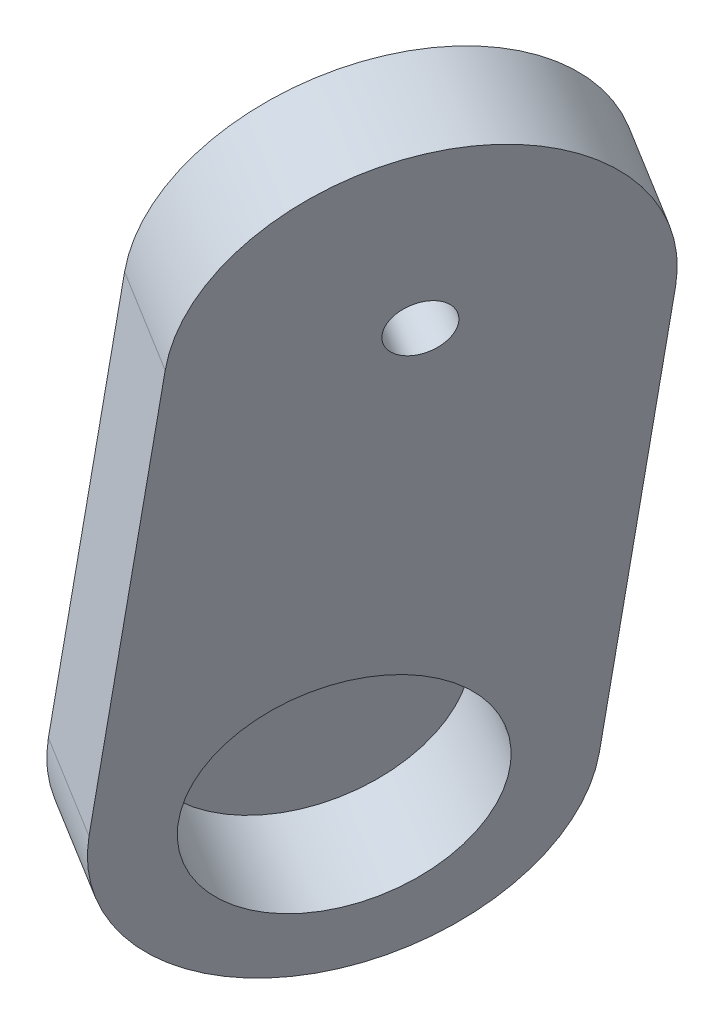
ISO-10303-21;
HEADER;
FILE_DESCRIPTION(('STEP AP214'),'2;1');
FILE_NAME('part.step','',(''),(''),'','','');
FILE_SCHEMA(('AUTOMOTIVE_DESIGN { 1 0 10303 214 1 1 1 1 }'));
ENDSEC;
DATA;
#1=APPLICATION_CONTEXT('core data for automotive mechanical design processes');
#2=APPLICATION_PROTOCOL_DEFINITION('international standard','automotive_design',2000,#1);
#3=PRODUCT_CONTEXT('',#1,'mechanical');
#4=PRODUCT('Part','Part','',(#3));
#5=PRODUCT_RELATED_PRODUCT_CATEGORY('part','',(#4));
#6=PRODUCT_DEFINITION_FORMATION('','',#4);
#7=PRODUCT_DEFINITION_CONTEXT('part definition',#1,'design');
#8=PRODUCT_DEFINITION('design','',#6,#7);
#9=PRODUCT_DEFINITION_SHAPE('','',#8);
#10=(LENGTH_UNIT() NAMED_UNIT(*) SI_UNIT(.MILLI.,.METRE.));
#11=(NAMED_UNIT(*) PLANE_ANGLE_UNIT() SI_UNIT($,.RADIAN.));
#12=(NAMED_UNIT(*) SI_UNIT($,.STERADIAN.) SOLID_ANGLE_UNIT());
#13=UNCERTAINTY_MEASURE_WITH_UNIT(LENGTH_MEASURE(1.E-05),#10,'distance_accuracy_value','');
#14=(GEOMETRIC_REPRESENTATION_CONTEXT(3) GLOBAL_UNCERTAINTY_ASSIGNED_CONTEXT((#13)) GLOBAL_UNIT_ASSIGNED_CONTEXT((#10,
#11,#12)) REPRESENTATION_CONTEXT('',''));
#15=CARTESIAN_POINT('',(0.,0.,0.));
#16=DIRECTION('',(0.,0.,1.));
#17=DIRECTION('',(1.,0.,0.));
#18=AXIS2_PLACEMENT_3D('',#15,#16,#17);
#19=CARTESIAN_POINT('',(-811.013503591697,18.1485697870041,354.165726982782));
#20=DIRECTION('',(0.865247481188387,-0.242317919068746,0.438895001561131));
#21=DIRECTION('',(0.452377245537879,0.,-0.891826680313816));
#22=AXIS2_PLACEMENT_3D('',#19,#20,#21);
#23=PLANE('',#22);
#24=CARTESIAN_POINT('',(-811.013503591697,18.1485697870041,354.165726982782));
#25=DIRECTION('',(0.865247481188387,-0.242317919068746,0.438895001561131));
#26=DIRECTION('',(0.452377245537879,0.,-0.891826680313816));
#27=AXIS2_PLACEMENT_3D('',#24,#25,#26);
#28=CIRCLE('',#27,1.50000000000011);
#29=CARTESIAN_POINT('',(-810.33493772339,18.1485697870041,352.827986962312));
#30=VERTEX_POINT('',#29);
#31=EDGE_CURVE('E105',#30,#30,#28,.T.);
#32=ORIENTED_EDGE('',*,*,#31,.F.);
#33=EDGE_LOOP('',(#32));
#34=FACE_BOUND('',#33,.T.);
#35=CARTESIAN_POINT('',(-811.013503591697,18.1485697870041,354.165726982782));
#36=DIRECTION('',(0.865247481188387,-0.242317919068746,0.438895001561131));
#37=DIRECTION('',(0.452377245537879,0.,-0.891826680313816));
#38=AXIS2_PLACEMENT_3D('',#35,#36,#37);
#39=CIRCLE('',#38,9.99999999999999);
#40=CARTESIAN_POINT('',(-806.568758832593,17.8064120444397,345.214348758977));
#41=VERTEX_POINT('',#40);
#42=CARTESIAN_POINT('',(-815.458248350801,18.4907275295685,363.117105206588));
#43=VERTEX_POINT('',#42);
#44=EDGE_CURVE('E88',#41,#43,#39,.T.);
#45=ORIENTED_EDGE('',*,*,#44,.T.);
#46=DIRECTION('',(-0.231925066694684,-0.969593371929813,-0.078099017589475));
#47=VECTOR('',#46,1.);
#48=CARTESIAN_POINT('',(-815.458248350801,18.4907275295685,363.117105206588));
#49=LINE('',#48,#47);
#50=CARTESIAN_POINT('',(-821.488300084863,-6.7187001406066,361.086530749262));
#51=VERTEX_POINT('',#50);
#52=EDGE_CURVE('E83',#43,#51,#49,.T.);
#53=ORIENTED_EDGE('',*,*,#52,.T.);
#54=CARTESIAN_POINT('',(-817.043555325759,-7.06085788317104,352.135152525456));
#55=DIRECTION('',(0.865247481188387,-0.242317919068746,0.438895001561131));
#56=DIRECTION('',(0.452377245537879,0.,-0.891826680313816));
#57=AXIS2_PLACEMENT_3D('',#54,#55,#56);
#58=CIRCLE('',#57,9.99999999999999);
#59=CARTESIAN_POINT('',(-812.598810566655,-7.40301562573548,343.18377430165));
#60=VERTEX_POINT('',#59);
#61=EDGE_CURVE('E86',#51,#60,#58,.T.);
#62=ORIENTED_EDGE('',*,*,#61,.T.);
#63=DIRECTION('',(0.231925066694684,0.969593371929813,0.078099017589475));
#64=VECTOR('',#63,1.);
#65=CARTESIAN_POINT('',(-806.568758832593,17.8064120444397,345.214348758977));
#66=LINE('',#65,#64);
#67=EDGE_CURVE('E52',#60,#41,#66,.T.);
#68=ORIENTED_EDGE('',*,*,#67,.T.);
#69=EDGE_LOOP('',(#45,#53,#62,#68));
#70=FACE_BOUND('',#69,.T.);
#71=CARTESIAN_POINT('',(-817.043555325759,-7.06085788317104,352.135152525456));
#72=DIRECTION('',(0.865247481188387,-0.242317919068746,0.438895001561131));
#73=DIRECTION('',(0.452377245537879,0.,-0.891826680313816));
#74=AXIS2_PLACEMENT_3D('',#71,#72,#73);
#75=CIRCLE('',#74,6.49999999999995);
#76=CARTESIAN_POINT('',(-814.103103229763,-7.06085788317104,346.338279103416));
#77=VERTEX_POINT('',#76);
#78=EDGE_CURVE('E122',#77,#77,#75,.T.);
#79=ORIENTED_EDGE('',*,*,#78,.F.);
#80=EDGE_LOOP('',(#79));
#81=FACE_BOUND('',#80,.T.);
#82=ADVANCED_FACE('F35',(#34,#70,#81),#23,.T.);
#83=CARTESIAN_POINT('',(-815.339740997639,19.3601593823478,351.971251974977));
#84=DIRECTION('',(0.865247481188387,-0.242317919068746,0.438895001561131));
#85=DIRECTION('',(0.452377245537879,0.,-0.891826680313816));
#86=AXIS2_PLACEMENT_3D('',#83,#84,#85);
#87=PLANE('',#86);
#88=CARTESIAN_POINT('',(-821.369792731701,-5.84926828782731,349.94067751765));
#89=DIRECTION('',(0.865247481188387,-0.242317919068746,0.438895001561131));
#90=DIRECTION('',(0.452377245537879,0.,-0.891826680313816));
#91=AXIS2_PLACEMENT_3D('',#88,#89,#90);
#92=CIRCLE('',#91,8.00000000000001);
#93=CARTESIAN_POINT('',(-817.750774767398,-5.84926828782731,342.80606407514));
#94=VERTEX_POINT('',#93);
#95=EDGE_CURVE('E11',#94,#94,#92,.F.);
#96=ORIENTED_EDGE('',*,*,#95,.F.);
#97=EDGE_LOOP('',(#96));
#98=FACE_BOUND('',#97,.T.);
#99=CARTESIAN_POINT('',(-815.339740997639,19.3601593823478,351.971251974977));
#100=DIRECTION('',(0.865247481188387,-0.242317919068746,0.438895001561131));
#101=DIRECTION('',(0.452377245537879,0.,-0.891826680313816));
#102=AXIS2_PLACEMENT_3D('',#99,#100,#101);
#103=CIRCLE('',#102,9.99999999999999);
#104=CARTESIAN_POINT('',(-810.894996238535,19.0180016397834,343.019873751171));
#105=VERTEX_POINT('',#104);
#106=CARTESIAN_POINT('',(-819.784485756743,19.7023171249123,360.922630198782));
#107=VERTEX_POINT('',#106);
#108=EDGE_CURVE('E102',#105,#107,#103,.T.);
#109=ORIENTED_EDGE('',*,*,#108,.F.);
#110=DIRECTION('',(0.231925066694684,0.969593371929813,0.078099017589475));
#111=VECTOR('',#110,1.);
#112=CARTESIAN_POINT('',(-810.894996238535,19.0180016397834,343.019873751171));
#113=LINE('',#112,#111);
#114=CARTESIAN_POINT('',(-816.925047972597,-6.19142603039175,340.989299293845));
#115=VERTEX_POINT('',#114);
#116=EDGE_CURVE('E75',#115,#105,#113,.T.);
#117=ORIENTED_EDGE('',*,*,#116,.F.);
#118=CARTESIAN_POINT('',(-821.369792731701,-5.84926828782731,349.94067751765));
#119=DIRECTION('',(0.865247481188387,-0.242317919068746,0.438895001561131));
#120=DIRECTION('',(0.452377245537879,0.,-0.891826680313816));
#121=AXIS2_PLACEMENT_3D('',#118,#119,#120);
#122=CIRCLE('',#121,9.99999999999999);
#123=CARTESIAN_POINT('',(-825.814537490805,-5.50711054526287,358.892055741456));
#124=VERTEX_POINT('',#123);
#125=EDGE_CURVE('E69',#124,#115,#122,.T.);
#126=ORIENTED_EDGE('',*,*,#125,.F.);
#127=DIRECTION('',(-0.231925066694684,-0.969593371929813,-0.078099017589475));
#128=VECTOR('',#127,1.);
#129=CARTESIAN_POINT('',(-819.784485756743,19.7023171249123,360.922630198782));
#130=LINE('',#129,#128);
#131=EDGE_CURVE('E93',#107,#124,#130,.T.);
#132=ORIENTED_EDGE('',*,*,#131,.F.);
#133=EDGE_LOOP('',(#109,#117,#126,#132));
#134=FACE_BOUND('',#133,.T.);
#135=CARTESIAN_POINT('',(-815.339740997639,19.3601593823478,351.971251974977));
#136=DIRECTION('',(0.865247481188387,-0.242317919068746,0.438895001561131));
#137=DIRECTION('',(0.452377245537879,0.,-0.891826680313816));
#138=AXIS2_PLACEMENT_3D('',#135,#136,#137);
#139=CIRCLE('',#138,1.50000000000011);
#140=CARTESIAN_POINT('',(-814.661175129332,19.3601593823478,350.633511954506));
#141=VERTEX_POINT('',#140);
#142=EDGE_CURVE('E120',#141,#141,#139,.T.);
#143=ORIENTED_EDGE('',*,*,#142,.T.);
#144=EDGE_LOOP('',(#143));
#145=FACE_BOUND('',#144,.T.);
#146=ADVANCED_FACE('F113',(#98,#134,#145),#87,.F.);
#147=CARTESIAN_POINT('',(-811.013503591697,18.1485697870041,354.165726982782));
#148=DIRECTION('',(-0.865247481188387,0.242317919068746,-0.438895001561131));
#149=DIRECTION('',(-0.452377245537879,0.,0.891826680313816));
#150=AXIS2_PLACEMENT_3D('',#147,#148,#149);
#151=CYLINDRICAL_SURFACE('',#150,9.99999999999999);
#152=ORIENTED_EDGE('',*,*,#108,.T.);
#153=DIRECTION('',(-0.865247481188387,0.242317919068746,-0.438895001561131));
#154=VECTOR('',#153,1.);
#155=CARTESIAN_POINT('',(-815.458248350801,18.4907275295685,363.117105206588));
#156=LINE('',#155,#154);
#157=EDGE_CURVE('E44',#43,#107,#156,.T.);
#158=ORIENTED_EDGE('',*,*,#157,.F.);
#159=ORIENTED_EDGE('',*,*,#44,.F.);
#160=DIRECTION('',(-0.865247481188387,0.242317919068746,-0.438895001561131));
#161=VECTOR('',#160,1.);
#162=CARTESIAN_POINT('',(-806.568758832593,17.8064120444397,345.214348758977));
#163=LINE('',#162,#161);
#164=EDGE_CURVE('E98',#41,#105,#163,.T.);
#165=ORIENTED_EDGE('',*,*,#164,.T.);
#166=EDGE_LOOP('',(#152,#158,#159,#165));
#167=FACE_BOUND('',#166,.T.);
#168=ADVANCED_FACE('F37',(#167),#151,.T.);
#169=CARTESIAN_POINT('',(-815.458248350801,18.4907275295685,363.117105206588));
#170=DIRECTION('',(0.444474475910392,-0.034215774256448,-0.895137822380561));
#171=DIRECTION('',(-0.895662260424,0.,-0.444734881982705));
#172=AXIS2_PLACEMENT_3D('',#169,#170,#171);
#173=PLANE('',#172);
#174=ORIENTED_EDGE('',*,*,#131,.T.);
#175=DIRECTION('',(-0.865247481188387,0.242317919068746,-0.438895001561131));
#176=VECTOR('',#175,1.);
#177=CARTESIAN_POINT('',(-821.488300084863,-6.7187001406066,361.086530749262));
#178=LINE('',#177,#176);
#179=EDGE_CURVE('E91',#51,#124,#178,.T.);
#180=ORIENTED_EDGE('',*,*,#179,.F.);
#181=ORIENTED_EDGE('',*,*,#52,.F.);
#182=ORIENTED_EDGE('',*,*,#157,.T.);
#183=EDGE_LOOP('',(#174,#180,#181,#182));
#184=FACE_BOUND('',#183,.T.);
#185=ADVANCED_FACE('F92',(#184),#173,.F.);
#186=CARTESIAN_POINT('',(-817.043555325759,-7.06085788317104,352.135152525456));
#187=DIRECTION('',(-0.865247481188387,0.242317919068746,-0.438895001561131));
#188=DIRECTION('',(-0.452377245537879,0.,0.891826680313816));
#189=AXIS2_PLACEMENT_3D('',#186,#187,#188);
#190=CYLINDRICAL_SURFACE('',#189,9.99999999999999);
#191=ORIENTED_EDGE('',*,*,#125,.T.);
#192=DIRECTION('',(-0.865247481188387,0.242317919068746,-0.438895001561131));
#193=VECTOR('',#192,1.);
#194=CARTESIAN_POINT('',(-812.598810566655,-7.40301562573548,343.18377430165));
#195=LINE('',#194,#193);
#196=EDGE_CURVE('E94',#60,#115,#195,.T.);
#197=ORIENTED_EDGE('',*,*,#196,.F.);
#198=ORIENTED_EDGE('',*,*,#61,.F.);
#199=ORIENTED_EDGE('',*,*,#179,.T.);
#200=EDGE_LOOP('',(#191,#197,#198,#199));
#201=FACE_BOUND('',#200,.T.);
#202=ADVANCED_FACE('F96',(#201),#190,.T.);
#203=CARTESIAN_POINT('',(-806.568758832593,17.8064120444397,345.214348758977));
#204=DIRECTION('',(-0.444474475910392,0.034215774256448,0.895137822380561));
#205=DIRECTION('',(0.895662260424,0.,0.444734881982705));
#206=AXIS2_PLACEMENT_3D('',#203,#204,#205);
#207=PLANE('',#206);
#208=ORIENTED_EDGE('',*,*,#116,.T.);
#209=ORIENTED_EDGE('',*,*,#164,.F.);
#210=ORIENTED_EDGE('',*,*,#67,.F.);
#211=ORIENTED_EDGE('',*,*,#196,.T.);
#212=EDGE_LOOP('',(#208,#209,#210,#211));
#213=FACE_BOUND('',#212,.T.);
#214=ADVANCED_FACE('F162',(#213),#207,.F.);
#215=CARTESIAN_POINT('',(-811.013503591697,18.1485697870041,354.165726982782));
#216=DIRECTION('',(-0.865247481188387,0.242317919068746,-0.438895001561131));
#217=DIRECTION('',(-0.452377245537879,0.,0.891826680313816));
#218=AXIS2_PLACEMENT_3D('',#215,#216,#217);
#219=CYLINDRICAL_SURFACE('',#218,1.50000000000011);
#220=ORIENTED_EDGE('',*,*,#31,.T.);
#221=EDGE_LOOP('',(#220));
#222=FACE_BOUND('',#221,.T.);
#223=ORIENTED_EDGE('',*,*,#142,.F.);
#224=EDGE_LOOP('',(#223));
#225=FACE_BOUND('',#224,.T.);
#226=ADVANCED_FACE('F160',(#222,#225),#219,.F.);
#227=CARTESIAN_POINT('',(-817.043555325759,-7.06085788317104,352.135152525456));
#228=DIRECTION('',(-0.865247481188387,0.242317919068746,-0.438895001561131));
#229=DIRECTION('',(-0.452377245537879,0.,0.891826680313816));
#230=AXIS2_PLACEMENT_3D('',#227,#228,#229);
#231=CYLINDRICAL_SURFACE('',#230,6.49999999999995);
#232=ORIENTED_EDGE('',*,*,#78,.T.);
#233=EDGE_LOOP('',(#232));
#234=FACE_BOUND('',#233,.T.);
#235=CARTESIAN_POINT('',(-821.369792731701,-5.84926828782731,349.94067751765));
#236=DIRECTION('',(0.865247481188387,-0.242317919068746,0.438895001561131));
#237=DIRECTION('',(0.452377245537879,0.,-0.891826680313816));
#238=AXIS2_PLACEMENT_3D('',#235,#236,#237);
#239=CIRCLE('',#238,6.49999999999995);
#240=CARTESIAN_POINT('',(-818.429340635705,-5.84926828782731,344.14380409561));
#241=VERTEX_POINT('',#240);
#242=EDGE_CURVE('E127',#241,#241,#239,.T.);
#243=ORIENTED_EDGE('',*,*,#242,.F.);
#244=EDGE_LOOP('',(#243));
#245=FACE_BOUND('',#244,.T.);
#246=ADVANCED_FACE('F149',(#234,#245),#231,.F.);
#247=CARTESIAN_POINT('',(-821.369792731701,-5.84926828782731,349.94067751765));
#248=DIRECTION('',(-0.865247481188387,0.242317919068746,-0.438895001561131));
#249=DIRECTION('',(-0.452377245537879,0.,0.891826680313816));
#250=AXIS2_PLACEMENT_3D('',#247,#248,#249);
#251=PLANE('',#250);
#252=ORIENTED_EDGE('',*,*,#242,.T.);
#253=EDGE_LOOP('',(#252));
#254=FACE_BOUND('',#253,.T.);
#255=ADVANCED_FACE('F141',(#254),#251,.F.);
#256=CARTESIAN_POINT('',(-823.100287694077,-5.36463244968982,349.062887514528));
#257=DIRECTION('',(0.865247481188387,-0.242317919068746,0.438895001561131));
#258=DIRECTION('',(0.452377245537879,0.,-0.891826680313816));
#259=AXIS2_PLACEMENT_3D('',#256,#257,#258);
#260=CYLINDRICAL_SURFACE('',#259,8.00000000000001);
#261=CARTESIAN_POINT('',(-823.100287694077,-5.36463244968982,349.062887514528));
#262=DIRECTION('',(-0.865247481188387,0.242317919068746,-0.438895001561131));
#263=DIRECTION('',(-0.452377245537879,0.,0.891826680313816));
#264=AXIS2_PLACEMENT_3D('',#261,#262,#263);
#265=CIRCLE('',#264,8.00000000000001);
#266=CARTESIAN_POINT('',(-826.719305658381,-5.36463244968982,356.197500957038));
#267=VERTEX_POINT('',#266);
#268=EDGE_CURVE('E131',#267,#267,#265,.T.);
#269=ORIENTED_EDGE('',*,*,#268,.F.);
#270=EDGE_LOOP('',(#269));
#271=FACE_BOUND('',#270,.T.);
#272=ORIENTED_EDGE('',*,*,#95,.T.);
#273=EDGE_LOOP('',(#272));
#274=FACE_BOUND('',#273,.T.);
#275=ADVANCED_FACE('F138',(#271,#274),#260,.T.);
#276=CARTESIAN_POINT('',(-823.100287694077,-5.36463244968982,349.062887514528));
#277=DIRECTION('',(-0.865247481188387,0.242317919068746,-0.438895001561131));
#278=DIRECTION('',(-0.452377245537879,0.,0.891826680313816));
#279=AXIS2_PLACEMENT_3D('',#276,#277,#278);
#280=PLANE('',#279);
#281=ORIENTED_EDGE('',*,*,#268,.T.);
#282=EDGE_LOOP('',(#281));
#283=FACE_BOUND('',#282,.T.);
#284=ADVANCED_FACE('F136',(#283),#280,.T.);
#285=CLOSED_SHELL('',(#82,#146,#168,#185,#202,#214,#226,#246,#255,#275,#284));
#286=MANIFOLD_SOLID_BREP('B2',#285);
#287=ADVANCED_BREP_SHAPE_REPRESENTATION('',(#18,#286),#14);
#288=SHAPE_DEFINITION_REPRESENTATION(#9,#287);
ENDSEC;
END-ISO-10303-21;
